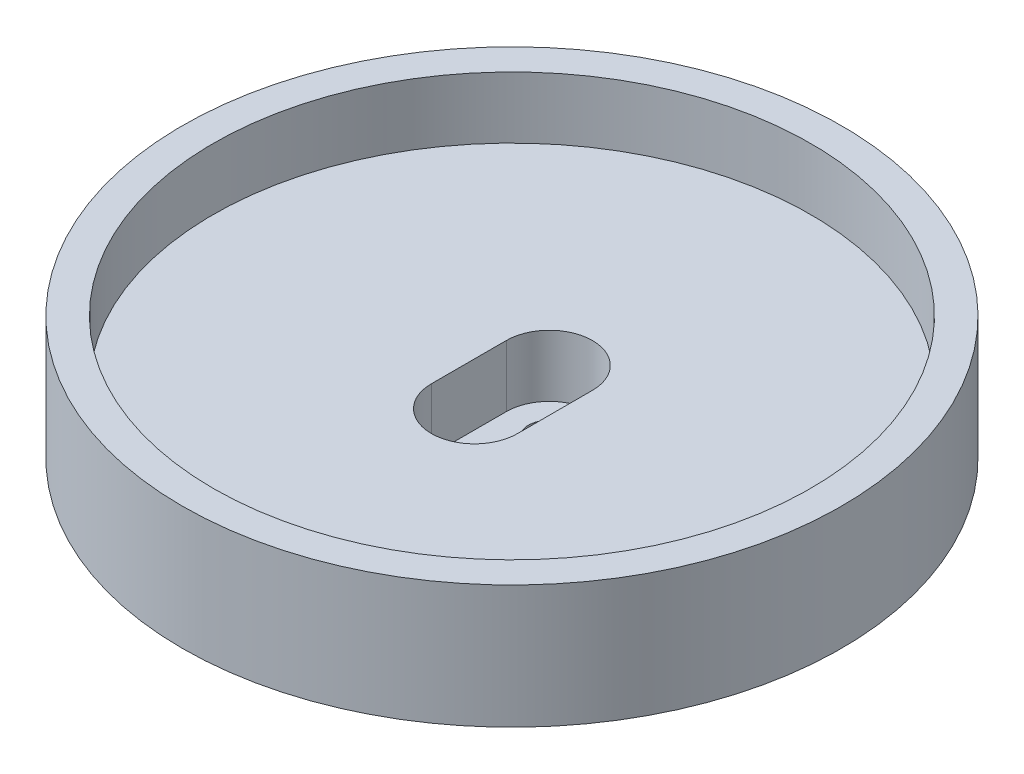
ISO-10303-21;
HEADER;
FILE_DESCRIPTION(('STEP AP214'),'2;1');
FILE_NAME('part.step','',(''),(''),'','','');
FILE_SCHEMA(('AUTOMOTIVE_DESIGN { 1 0 10303 214 1 1 1 1 }'));
ENDSEC;
DATA;
#1=APPLICATION_CONTEXT('core data for automotive mechanical design processes');
#2=APPLICATION_PROTOCOL_DEFINITION('international standard','automotive_design',2000,#1);
#3=PRODUCT_CONTEXT('',#1,'mechanical');
#4=PRODUCT('Part','Part','',(#3));
#5=PRODUCT_RELATED_PRODUCT_CATEGORY('part','',(#4));
#6=PRODUCT_DEFINITION_FORMATION('','',#4);
#7=PRODUCT_DEFINITION_CONTEXT('part definition',#1,'design');
#8=PRODUCT_DEFINITION('design','',#6,#7);
#9=PRODUCT_DEFINITION_SHAPE('','',#8);
#10=(LENGTH_UNIT() NAMED_UNIT(*) SI_UNIT(.MILLI.,.METRE.));
#11=(NAMED_UNIT(*) PLANE_ANGLE_UNIT() SI_UNIT($,.RADIAN.));
#12=(NAMED_UNIT(*) SI_UNIT($,.STERADIAN.) SOLID_ANGLE_UNIT());
#13=UNCERTAINTY_MEASURE_WITH_UNIT(LENGTH_MEASURE(1.E-05),#10,'distance_accuracy_value','');
#14=(GEOMETRIC_REPRESENTATION_CONTEXT(3) GLOBAL_UNCERTAINTY_ASSIGNED_CONTEXT((#13)) GLOBAL_UNIT_ASSIGNED_CONTEXT((#10,
#11,#12)) REPRESENTATION_CONTEXT('',''));
#15=CARTESIAN_POINT('',(0.,0.,0.));
#16=DIRECTION('',(0.,0.,1.));
#17=DIRECTION('',(1.,0.,0.));
#18=AXIS2_PLACEMENT_3D('',#15,#16,#17);
#19=CARTESIAN_POINT('',(0.,0.,0.));
#20=DIRECTION('',(0.,1.,0.));
#21=DIRECTION('',(0.,0.,1.));
#22=AXIS2_PLACEMENT_3D('',#19,#20,#21);
#23=PLANE('',#22);
#24=CARTESIAN_POINT('',(0.,0.,0.));
#25=DIRECTION('',(0.,1.,0.));
#26=DIRECTION('',(0.,0.,1.));
#27=AXIS2_PLACEMENT_3D('',#24,#25,#26);
#28=CIRCLE('',#27,26.75);
#29=CARTESIAN_POINT('',(0.,0.,26.75));
#30=VERTEX_POINT('',#29);
#31=EDGE_CURVE('E171',#30,#30,#28,.T.);
#32=ORIENTED_EDGE('',*,*,#31,.F.);
#33=EDGE_LOOP('',(#32));
#34=FACE_BOUND('',#33,.T.);
#35=DIRECTION('',(-1.,0.,0.));
#36=VECTOR('',#35,1.);
#37=CARTESIAN_POINT('',(-6.,0.,10.));
#38=LINE('',#37,#36);
#39=CARTESIAN_POINT('',(6.,0.,10.));
#40=VERTEX_POINT('',#39);
#41=CARTESIAN_POINT('',(-6.,0.,10.));
#42=VERTEX_POINT('',#41);
#43=EDGE_CURVE('E129',#40,#42,#38,.T.);
#44=ORIENTED_EDGE('',*,*,#43,.F.);
#45=DIRECTION('',(0.,0.,1.));
#46=VECTOR('',#45,1.);
#47=CARTESIAN_POINT('',(6.,0.,10.));
#48=LINE('',#47,#46);
#49=CARTESIAN_POINT('',(6.,0.,-10.));
#50=VERTEX_POINT('',#49);
#51=EDGE_CURVE('E126',#50,#40,#48,.T.);
#52=ORIENTED_EDGE('',*,*,#51,.F.);
#53=DIRECTION('',(1.,0.,0.));
#54=VECTOR('',#53,1.);
#55=CARTESIAN_POINT('',(-6.,0.,-10.));
#56=LINE('',#55,#54);
#57=CARTESIAN_POINT('',(-6.,0.,-10.));
#58=VERTEX_POINT('',#57);
#59=EDGE_CURVE('E62',#58,#50,#56,.T.);
#60=ORIENTED_EDGE('',*,*,#59,.F.);
#61=DIRECTION('',(0.,0.,-1.));
#62=VECTOR('',#61,1.);
#63=CARTESIAN_POINT('',(-6.,0.,10.));
#64=LINE('',#63,#62);
#65=EDGE_CURVE('E57',#42,#58,#64,.T.);
#66=ORIENTED_EDGE('',*,*,#65,.F.);
#67=EDGE_LOOP('',(#44,#52,#60,#66));
#68=FACE_BOUND('',#67,.T.);
#69=ADVANCED_FACE('F39',(#34,#68),#23,.F.);
#70=CARTESIAN_POINT('',(0.,10.,0.));
#71=DIRECTION('',(0.,-1.,0.));
#72=DIRECTION('',(0.,0.,-1.));
#73=AXIS2_PLACEMENT_3D('',#70,#71,#72);
#74=CYLINDRICAL_SURFACE('',#73,26.75);
#75=CARTESIAN_POINT('',(0.,10.,0.));
#76=DIRECTION('',(0.,1.,0.));
#77=DIRECTION('',(0.,0.,1.));
#78=AXIS2_PLACEMENT_3D('',#75,#76,#77);
#79=CIRCLE('',#78,26.75);
#80=CARTESIAN_POINT('',(0.,10.,26.75));
#81=VERTEX_POINT('',#80);
#82=EDGE_CURVE('E175',#81,#81,#79,.T.);
#83=ORIENTED_EDGE('',*,*,#82,.F.);
#84=EDGE_LOOP('',(#83));
#85=FACE_BOUND('',#84,.T.);
#86=ORIENTED_EDGE('',*,*,#31,.T.);
#87=EDGE_LOOP('',(#86));
#88=FACE_BOUND('',#87,.T.);
#89=ADVANCED_FACE('F41',(#85,#88),#74,.T.);
#90=CARTESIAN_POINT('',(0.,10.,0.));
#91=DIRECTION('',(0.,1.,0.));
#92=DIRECTION('',(0.,0.,1.));
#93=AXIS2_PLACEMENT_3D('',#90,#91,#92);
#94=PLANE('',#93);
#95=CARTESIAN_POINT('',(0.,10.,0.));
#96=DIRECTION('',(0.,1.,0.));
#97=DIRECTION('',(0.,0.,1.));
#98=AXIS2_PLACEMENT_3D('',#95,#96,#97);
#99=CIRCLE('',#98,24.25);
#100=CARTESIAN_POINT('',(0.,10.,24.25));
#101=VERTEX_POINT('',#100);
#102=EDGE_CURVE('E157',#101,#101,#99,.T.);
#103=ORIENTED_EDGE('',*,*,#102,.F.);
#104=EDGE_LOOP('',(#103));
#105=FACE_BOUND('',#104,.T.);
#106=ORIENTED_EDGE('',*,*,#82,.T.);
#107=EDGE_LOOP('',(#106));
#108=FACE_BOUND('',#107,.T.);
#109=ADVANCED_FACE('F242',(#105,#108),#94,.T.);
#110=CARTESIAN_POINT('',(0.,5.,0.));
#111=DIRECTION('',(0.,1.,0.));
#112=DIRECTION('',(0.,0.,1.));
#113=AXIS2_PLACEMENT_3D('',#110,#111,#112);
#114=CYLINDRICAL_SURFACE('',#113,24.25);
#115=CARTESIAN_POINT('',(0.,5.,0.));
#116=DIRECTION('',(0.,1.,0.));
#117=DIRECTION('',(0.,0.,1.));
#118=AXIS2_PLACEMENT_3D('',#115,#116,#117);
#119=CIRCLE('',#118,24.25);
#120=CARTESIAN_POINT('',(0.,5.,24.25));
#121=VERTEX_POINT('',#120);
#122=EDGE_CURVE('E167',#121,#121,#119,.T.);
#123=ORIENTED_EDGE('',*,*,#122,.F.);
#124=EDGE_LOOP('',(#123));
#125=FACE_BOUND('',#124,.T.);
#126=ORIENTED_EDGE('',*,*,#102,.T.);
#127=EDGE_LOOP('',(#126));
#128=FACE_BOUND('',#127,.T.);
#129=ADVANCED_FACE('F248',(#125,#128),#114,.F.);
#130=CARTESIAN_POINT('',(0.,5.,0.));
#131=DIRECTION('',(0.,1.,0.));
#132=DIRECTION('',(0.,0.,1.));
#133=AXIS2_PLACEMENT_3D('',#130,#131,#132);
#134=PLANE('',#133);
#135=DIRECTION('',(0.,0.,1.));
#136=VECTOR('',#135,1.);
#137=CARTESIAN_POINT('',(-3.5,5.,-3.03908061795286));
#138=LINE('',#137,#136);
#139=CARTESIAN_POINT('',(-3.5,5.,-3.03908061795286));
#140=VERTEX_POINT('',#139);
#141=CARTESIAN_POINT('',(-3.5,5.,3.03908061795286));
#142=VERTEX_POINT('',#141);
#143=EDGE_CURVE('E131',#140,#142,#138,.T.);
#144=ORIENTED_EDGE('',*,*,#143,.F.);
#145=CARTESIAN_POINT('',(0.,5.,-3.03908061795286));
#146=DIRECTION('',(0.,1.,0.));
#147=DIRECTION('',(0.,0.,1.));
#148=AXIS2_PLACEMENT_3D('',#145,#146,#147);
#149=CIRCLE('',#148,3.5);
#150=CARTESIAN_POINT('',(3.5,5.,-3.03908061795287));
#151=VERTEX_POINT('',#150);
#152=EDGE_CURVE('E149',#151,#140,#149,.T.);
#153=ORIENTED_EDGE('',*,*,#152,.F.);
#154=DIRECTION('',(0.,0.,1.));
#155=VECTOR('',#154,1.);
#156=CARTESIAN_POINT('',(3.5,5.,-3.03908061795287));
#157=LINE('',#156,#155);
#158=CARTESIAN_POINT('',(3.5,5.,3.03908061795286));
#159=VERTEX_POINT('',#158);
#160=EDGE_CURVE('E145',#151,#159,#157,.T.);
#161=ORIENTED_EDGE('',*,*,#160,.T.);
#162=CARTESIAN_POINT('',(0.,5.,3.03908061795286));
#163=DIRECTION('',(0.,1.,0.));
#164=DIRECTION('',(0.,0.,1.));
#165=AXIS2_PLACEMENT_3D('',#162,#163,#164);
#166=CIRCLE('',#165,3.5);
#167=EDGE_CURVE('E136',#142,#159,#166,.T.);
#168=ORIENTED_EDGE('',*,*,#167,.F.);
#169=EDGE_LOOP('',(#144,#153,#161,#168));
#170=FACE_BOUND('',#169,.T.);
#171=ORIENTED_EDGE('',*,*,#122,.T.);
#172=EDGE_LOOP('',(#171));
#173=FACE_BOUND('',#172,.T.);
#174=ADVANCED_FACE('F252',(#170,#173),#134,.T.);
#175=CARTESIAN_POINT('',(-3.5,-1.,-3.03908061795286));
#176=DIRECTION('',(-1.,0.,0.));
#177=DIRECTION('',(0.,0.,1.));
#178=AXIS2_PLACEMENT_3D('',#175,#176,#177);
#179=PLANE('',#178);
#180=DIRECTION('',(0.,1.,0.));
#181=VECTOR('',#180,1.);
#182=CARTESIAN_POINT('',(-3.5,-1.,-3.03908061795286));
#183=LINE('',#182,#181);
#184=CARTESIAN_POINT('',(-3.5,0.,-3.03908061795286));
#185=VERTEX_POINT('',#184);
#186=EDGE_CURVE('E154',#185,#140,#183,.T.);
#187=ORIENTED_EDGE('',*,*,#186,.T.);
#188=ORIENTED_EDGE('',*,*,#143,.T.);
#189=DIRECTION('',(0.,1.,0.));
#190=VECTOR('',#189,1.);
#191=CARTESIAN_POINT('',(-3.5,-1.,3.03908061795286));
#192=LINE('',#191,#190);
#193=CARTESIAN_POINT('',(-3.5,0.,3.03908061795286));
#194=VERTEX_POINT('',#193);
#195=EDGE_CURVE('E153',#194,#142,#192,.T.);
#196=ORIENTED_EDGE('',*,*,#195,.F.);
#197=DIRECTION('',(0.,0.,1.));
#198=VECTOR('',#197,1.);
#199=CARTESIAN_POINT('',(-3.5,0.,0.));
#200=LINE('',#199,#198);
#201=EDGE_CURVE('E11',#185,#194,#200,.T.);
#202=ORIENTED_EDGE('',*,*,#201,.F.);
#203=EDGE_LOOP('',(#187,#188,#196,#202));
#204=FACE_BOUND('',#203,.T.);
#205=ADVANCED_FACE('F256',(#204),#179,.F.);
#206=CARTESIAN_POINT('',(0.,-1.,-3.03908061795286));
#207=DIRECTION('',(0.,1.,0.));
#208=DIRECTION('',(0.,0.,1.));
#209=AXIS2_PLACEMENT_3D('',#206,#207,#208);
#210=CYLINDRICAL_SURFACE('',#209,3.5);
#211=DIRECTION('',(0.,1.,0.));
#212=VECTOR('',#211,1.);
#213=CARTESIAN_POINT('',(3.5,-1.,-3.03908061795287));
#214=LINE('',#213,#212);
#215=CARTESIAN_POINT('',(3.5,0.,-3.03908061795287));
#216=VERTEX_POINT('',#215);
#217=EDGE_CURVE('E158',#216,#151,#214,.T.);
#218=ORIENTED_EDGE('',*,*,#217,.T.);
#219=ORIENTED_EDGE('',*,*,#152,.T.);
#220=ORIENTED_EDGE('',*,*,#186,.F.);
#221=CARTESIAN_POINT('',(0.,0.,-3.03908061795286));
#222=DIRECTION('',(0.,1.,0.));
#223=DIRECTION('',(0.,0.,1.));
#224=AXIS2_PLACEMENT_3D('',#221,#222,#223);
#225=CIRCLE('',#224,3.5);
#226=EDGE_CURVE('E49',#216,#185,#225,.T.);
#227=ORIENTED_EDGE('',*,*,#226,.F.);
#228=EDGE_LOOP('',(#218,#219,#220,#227));
#229=FACE_BOUND('',#228,.T.);
#230=ADVANCED_FACE('F260',(#229),#210,.F.);
#231=CARTESIAN_POINT('',(3.5,-1.,-3.03908061795287));
#232=DIRECTION('',(-1.,0.,0.));
#233=DIRECTION('',(0.,0.,1.));
#234=AXIS2_PLACEMENT_3D('',#231,#232,#233);
#235=PLANE('',#234);
#236=DIRECTION('',(0.,0.,1.));
#237=VECTOR('',#236,1.);
#238=CARTESIAN_POINT('',(3.5,0.,0.));
#239=LINE('',#238,#237);
#240=CARTESIAN_POINT('',(3.5,0.,3.03908061795286));
#241=VERTEX_POINT('',#240);
#242=EDGE_CURVE('E186',#216,#241,#239,.T.);
#243=ORIENTED_EDGE('',*,*,#242,.T.);
#244=DIRECTION('',(0.,1.,0.));
#245=VECTOR('',#244,1.);
#246=CARTESIAN_POINT('',(3.5,-1.,3.03908061795286));
#247=LINE('',#246,#245);
#248=EDGE_CURVE('E162',#241,#159,#247,.T.);
#249=ORIENTED_EDGE('',*,*,#248,.T.);
#250=ORIENTED_EDGE('',*,*,#160,.F.);
#251=ORIENTED_EDGE('',*,*,#217,.F.);
#252=EDGE_LOOP('',(#243,#249,#250,#251));
#253=FACE_BOUND('',#252,.T.);
#254=ADVANCED_FACE('F266',(#253),#235,.T.);
#255=CARTESIAN_POINT('',(0.,-1.,3.03908061795286));
#256=DIRECTION('',(0.,1.,0.));
#257=DIRECTION('',(0.,0.,1.));
#258=AXIS2_PLACEMENT_3D('',#255,#256,#257);
#259=CYLINDRICAL_SURFACE('',#258,3.5);
#260=ORIENTED_EDGE('',*,*,#195,.T.);
#261=ORIENTED_EDGE('',*,*,#167,.T.);
#262=ORIENTED_EDGE('',*,*,#248,.F.);
#263=CARTESIAN_POINT('',(0.,0.,3.03908061795286));
#264=DIRECTION('',(0.,1.,0.));
#265=DIRECTION('',(0.,0.,1.));
#266=AXIS2_PLACEMENT_3D('',#263,#264,#265);
#267=CIRCLE('',#266,3.5);
#268=EDGE_CURVE('E179',#194,#241,#267,.T.);
#269=ORIENTED_EDGE('',*,*,#268,.F.);
#270=EDGE_LOOP('',(#260,#261,#262,#269));
#271=FACE_BOUND('',#270,.T.);
#272=ADVANCED_FACE('F262',(#271),#259,.F.);
#273=CARTESIAN_POINT('',(0.,0.,0.));
#274=DIRECTION('',(0.,1.,0.));
#275=DIRECTION('',(0.,0.,1.));
#276=AXIS2_PLACEMENT_3D('',#273,#274,#275);
#277=PLANE('',#276);
#278=CARTESIAN_POINT('',(0.,0.,3.));
#279=DIRECTION('',(0.,1.,0.));
#280=DIRECTION('',(0.,0.,1.));
#281=AXIS2_PLACEMENT_3D('',#278,#279,#280);
#282=CIRCLE('',#281,1.65);
#283=CARTESIAN_POINT('',(0.,0.,4.65));
#284=VERTEX_POINT('',#283);
#285=EDGE_CURVE('E206',#284,#284,#282,.T.);
#286=ORIENTED_EDGE('',*,*,#285,.F.);
#287=EDGE_LOOP('',(#286));
#288=FACE_BOUND('',#287,.T.);
#289=CARTESIAN_POINT('',(0.,0.,-3.));
#290=DIRECTION('',(0.,1.,0.));
#291=DIRECTION('',(0.,0.,1.));
#292=AXIS2_PLACEMENT_3D('',#289,#290,#291);
#293=CIRCLE('',#292,1.65);
#294=CARTESIAN_POINT('',(0.,0.,-1.35));
#295=VERTEX_POINT('',#294);
#296=EDGE_CURVE('E194',#295,#295,#293,.T.);
#297=ORIENTED_EDGE('',*,*,#296,.F.);
#298=EDGE_LOOP('',(#297));
#299=FACE_BOUND('',#298,.T.);
#300=ORIENTED_EDGE('',*,*,#201,.T.);
#301=ORIENTED_EDGE('',*,*,#268,.T.);
#302=ORIENTED_EDGE('',*,*,#242,.F.);
#303=ORIENTED_EDGE('',*,*,#226,.T.);
#304=EDGE_LOOP('',(#300,#301,#302,#303));
#305=FACE_BOUND('',#304,.T.);
#306=ADVANCED_FACE('F265',(#288,#299,#305),#277,.T.);
#307=CARTESIAN_POINT('',(-6.,-4.,10.));
#308=DIRECTION('',(0.,0.,-1.));
#309=DIRECTION('',(-1.,0.,0.));
#310=AXIS2_PLACEMENT_3D('',#307,#308,#309);
#311=PLANE('',#310);
#312=ORIENTED_EDGE('',*,*,#43,.T.);
#313=DIRECTION('',(0.,1.,0.));
#314=VECTOR('',#313,1.);
#315=CARTESIAN_POINT('',(-6.,-4.,10.));
#316=LINE('',#315,#314);
#317=CARTESIAN_POINT('',(-6.,-4.,10.));
#318=VERTEX_POINT('',#317);
#319=EDGE_CURVE('E108',#318,#42,#316,.T.);
#320=ORIENTED_EDGE('',*,*,#319,.F.);
#321=DIRECTION('',(-1.,0.,0.));
#322=VECTOR('',#321,1.);
#323=CARTESIAN_POINT('',(-6.,-4.,10.));
#324=LINE('',#323,#322);
#325=CARTESIAN_POINT('',(6.,-4.,10.));
#326=VERTEX_POINT('',#325);
#327=EDGE_CURVE('E116',#326,#318,#324,.T.);
#328=ORIENTED_EDGE('',*,*,#327,.F.);
#329=DIRECTION('',(0.,1.,0.));
#330=VECTOR('',#329,1.);
#331=CARTESIAN_POINT('',(6.,-4.,10.));
#332=LINE('',#331,#330);
#333=EDGE_CURVE('E212',#326,#40,#332,.T.);
#334=ORIENTED_EDGE('',*,*,#333,.T.);
#335=EDGE_LOOP('',(#312,#320,#328,#334));
#336=FACE_BOUND('',#335,.T.);
#337=ADVANCED_FACE('F128',(#336),#311,.F.);
#338=CARTESIAN_POINT('',(-6.,-4.,10.));
#339=DIRECTION('',(1.,0.,0.));
#340=DIRECTION('',(0.,0.,-1.));
#341=AXIS2_PLACEMENT_3D('',#338,#339,#340);
#342=PLANE('',#341);
#343=ORIENTED_EDGE('',*,*,#65,.T.);
#344=DIRECTION('',(0.,1.,0.));
#345=VECTOR('',#344,1.);
#346=CARTESIAN_POINT('',(-6.,-4.,-10.));
#347=LINE('',#346,#345);
#348=CARTESIAN_POINT('',(-6.,-4.,-10.));
#349=VERTEX_POINT('',#348);
#350=EDGE_CURVE('E111',#349,#58,#347,.T.);
#351=ORIENTED_EDGE('',*,*,#350,.F.);
#352=DIRECTION('',(0.,0.,-1.));
#353=VECTOR('',#352,1.);
#354=CARTESIAN_POINT('',(-6.,-4.,10.));
#355=LINE('',#354,#353);
#356=EDGE_CURVE('E104',#318,#349,#355,.T.);
#357=ORIENTED_EDGE('',*,*,#356,.F.);
#358=ORIENTED_EDGE('',*,*,#319,.T.);
#359=EDGE_LOOP('',(#343,#351,#357,#358));
#360=FACE_BOUND('',#359,.T.);
#361=ADVANCED_FACE('F106',(#360),#342,.F.);
#362=CARTESIAN_POINT('',(-6.,-4.,-10.));
#363=DIRECTION('',(0.,0.,1.));
#364=DIRECTION('',(1.,0.,0.));
#365=AXIS2_PLACEMENT_3D('',#362,#363,#364);
#366=PLANE('',#365);
#367=ORIENTED_EDGE('',*,*,#59,.T.);
#368=DIRECTION('',(0.,1.,0.));
#369=VECTOR('',#368,1.);
#370=CARTESIAN_POINT('',(6.,-4.,-10.));
#371=LINE('',#370,#369);
#372=CARTESIAN_POINT('',(6.,-4.,-10.));
#373=VERTEX_POINT('',#372);
#374=EDGE_CURVE('E138',#373,#50,#371,.T.);
#375=ORIENTED_EDGE('',*,*,#374,.F.);
#376=DIRECTION('',(1.,0.,0.));
#377=VECTOR('',#376,1.);
#378=CARTESIAN_POINT('',(-6.,-4.,-10.));
#379=LINE('',#378,#377);
#380=EDGE_CURVE('E115',#349,#373,#379,.T.);
#381=ORIENTED_EDGE('',*,*,#380,.F.);
#382=ORIENTED_EDGE('',*,*,#350,.T.);
#383=EDGE_LOOP('',(#367,#375,#381,#382));
#384=FACE_BOUND('',#383,.T.);
#385=ADVANCED_FACE('F228',(#384),#366,.F.);
#386=CARTESIAN_POINT('',(6.,-4.,10.));
#387=DIRECTION('',(-1.,0.,0.));
#388=DIRECTION('',(0.,0.,1.));
#389=AXIS2_PLACEMENT_3D('',#386,#387,#388);
#390=PLANE('',#389);
#391=ORIENTED_EDGE('',*,*,#51,.T.);
#392=ORIENTED_EDGE('',*,*,#333,.F.);
#393=DIRECTION('',(0.,0.,1.));
#394=VECTOR('',#393,1.);
#395=CARTESIAN_POINT('',(6.,-4.,10.));
#396=LINE('',#395,#394);
#397=EDGE_CURVE('E121',#373,#326,#396,.T.);
#398=ORIENTED_EDGE('',*,*,#397,.F.);
#399=ORIENTED_EDGE('',*,*,#374,.T.);
#400=EDGE_LOOP('',(#391,#392,#398,#399));
#401=FACE_BOUND('',#400,.T.);
#402=ADVANCED_FACE('F226',(#401),#390,.F.);
#403=CARTESIAN_POINT('',(0.,-4.,0.));
#404=DIRECTION('',(0.,1.,0.));
#405=DIRECTION('',(0.,0.,1.));
#406=AXIS2_PLACEMENT_3D('',#403,#404,#405);
#407=PLANE('',#406);
#408=CARTESIAN_POINT('',(0.,-4.,3.));
#409=DIRECTION('',(0.,1.,0.));
#410=DIRECTION('',(0.,0.,1.));
#411=AXIS2_PLACEMENT_3D('',#408,#409,#410);
#412=CIRCLE('',#411,1.65);
#413=CARTESIAN_POINT('',(0.,-4.,4.65));
#414=VERTEX_POINT('',#413);
#415=EDGE_CURVE('E43',#414,#414,#412,.T.);
#416=ORIENTED_EDGE('',*,*,#415,.T.);
#417=EDGE_LOOP('',(#416));
#418=FACE_BOUND('',#417,.T.);
#419=CARTESIAN_POINT('',(0.,-4.,-3.));
#420=DIRECTION('',(0.,1.,0.));
#421=DIRECTION('',(0.,0.,1.));
#422=AXIS2_PLACEMENT_3D('',#419,#420,#421);
#423=CIRCLE('',#422,1.65);
#424=CARTESIAN_POINT('',(0.,-4.,-1.35));
#425=VERTEX_POINT('',#424);
#426=EDGE_CURVE('E191',#425,#425,#423,.T.);
#427=ORIENTED_EDGE('',*,*,#426,.T.);
#428=EDGE_LOOP('',(#427));
#429=FACE_BOUND('',#428,.T.);
#430=ORIENTED_EDGE('',*,*,#327,.T.);
#431=ORIENTED_EDGE('',*,*,#356,.T.);
#432=ORIENTED_EDGE('',*,*,#380,.T.);
#433=ORIENTED_EDGE('',*,*,#397,.T.);
#434=EDGE_LOOP('',(#430,#431,#432,#433));
#435=FACE_BOUND('',#434,.T.);
#436=ADVANCED_FACE('F119',(#418,#429,#435),#407,.F.);
#437=CARTESIAN_POINT('',(0.,-15.,-3.));
#438=DIRECTION('',(0.,1.,0.));
#439=DIRECTION('',(0.,0.,1.));
#440=AXIS2_PLACEMENT_3D('',#437,#438,#439);
#441=CYLINDRICAL_SURFACE('',#440,1.65);
#442=ORIENTED_EDGE('',*,*,#296,.T.);
#443=EDGE_LOOP('',(#442));
#444=FACE_BOUND('',#443,.T.);
#445=ORIENTED_EDGE('',*,*,#426,.F.);
#446=EDGE_LOOP('',(#445));
#447=FACE_BOUND('',#446,.T.);
#448=ADVANCED_FACE('F287',(#444,#447),#441,.F.);
#449=CARTESIAN_POINT('',(0.,-15.,3.));
#450=DIRECTION('',(0.,1.,0.));
#451=DIRECTION('',(0.,0.,1.));
#452=AXIS2_PLACEMENT_3D('',#449,#450,#451);
#453=CYLINDRICAL_SURFACE('',#452,1.65);
#454=ORIENTED_EDGE('',*,*,#285,.T.);
#455=EDGE_LOOP('',(#454));
#456=FACE_BOUND('',#455,.T.);
#457=ORIENTED_EDGE('',*,*,#415,.F.);
#458=EDGE_LOOP('',(#457));
#459=FACE_BOUND('',#458,.T.);
#460=ADVANCED_FACE('F291',(#456,#459),#453,.F.);
#461=CLOSED_SHELL('',(#69,#89,#109,#129,#174,#205,#230,#254,#272,#306,#337,#361,#385,#402,#436,
#448,#460));
#462=MANIFOLD_SOLID_BREP('B2',#461);
#463=ADVANCED_BREP_SHAPE_REPRESENTATION('',(#18,#462),#14);
#464=SHAPE_DEFINITION_REPRESENTATION(#9,#463);
ENDSEC;
END-ISO-10303-21;
